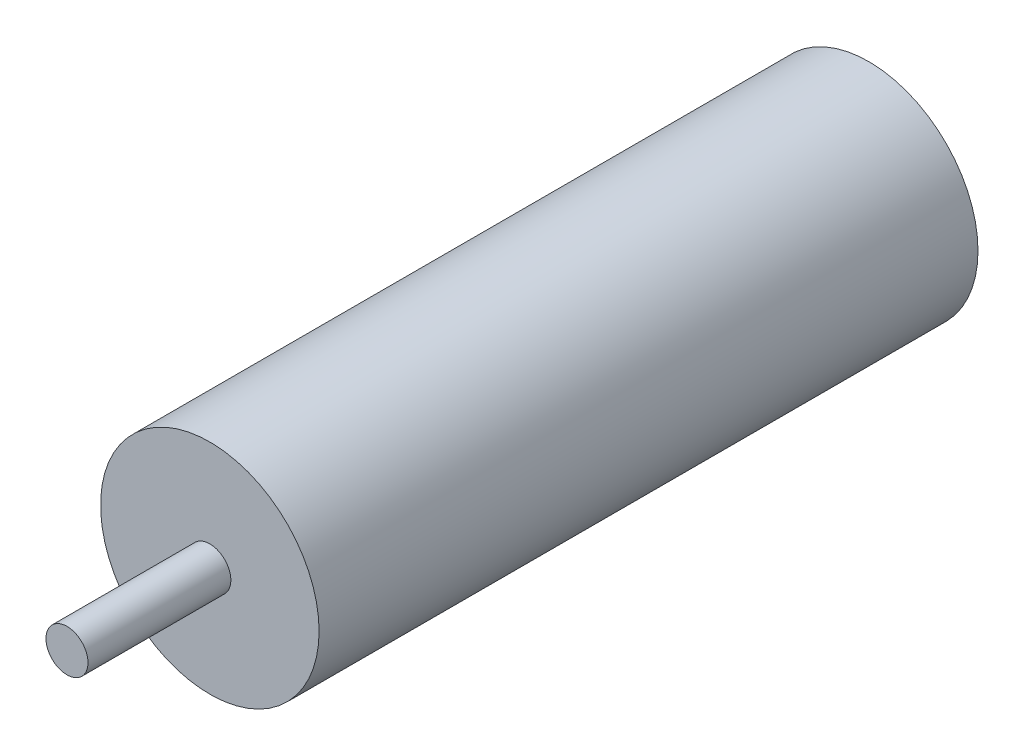
ISO-10303-21;
HEADER;
FILE_DESCRIPTION(('STEP AP214'),'2;1');
FILE_NAME('part.step','',(''),(''),'','','');
FILE_SCHEMA(('AUTOMOTIVE_DESIGN { 1 0 10303 214 1 1 1 1 }'));
ENDSEC;
DATA;
#1=APPLICATION_CONTEXT('core data for automotive mechanical design processes');
#2=APPLICATION_PROTOCOL_DEFINITION('international standard','automotive_design',2000,#1);
#3=PRODUCT_CONTEXT('',#1,'mechanical');
#4=PRODUCT('Part','Part','',(#3));
#5=PRODUCT_RELATED_PRODUCT_CATEGORY('part','',(#4));
#6=PRODUCT_DEFINITION_FORMATION('','',#4);
#7=PRODUCT_DEFINITION_CONTEXT('part definition',#1,'design');
#8=PRODUCT_DEFINITION('design','',#6,#7);
#9=PRODUCT_DEFINITION_SHAPE('','',#8);
#10=(LENGTH_UNIT() NAMED_UNIT(*) SI_UNIT(.MILLI.,.METRE.));
#11=(NAMED_UNIT(*) PLANE_ANGLE_UNIT() SI_UNIT($,.RADIAN.));
#12=(NAMED_UNIT(*) SI_UNIT($,.STERADIAN.) SOLID_ANGLE_UNIT());
#13=UNCERTAINTY_MEASURE_WITH_UNIT(LENGTH_MEASURE(1.E-05),#10,'distance_accuracy_value','');
#14=(GEOMETRIC_REPRESENTATION_CONTEXT(3) GLOBAL_UNCERTAINTY_ASSIGNED_CONTEXT((#13)) GLOBAL_UNIT_ASSIGNED_CONTEXT((#10,
#11,#12)) REPRESENTATION_CONTEXT('',''));
#15=CARTESIAN_POINT('',(0.,0.,0.));
#16=DIRECTION('',(0.,0.,1.));
#17=DIRECTION('',(1.,0.,0.));
#18=AXIS2_PLACEMENT_3D('',#15,#16,#17);
#19=CARTESIAN_POINT('',(0.,0.,78.4));
#20=DIRECTION('',(0.,0.,-1.));
#21=DIRECTION('',(-1.,0.,0.));
#22=AXIS2_PLACEMENT_3D('',#19,#20,#21);
#23=CYLINDRICAL_SURFACE('',#22,13.);
#24=CARTESIAN_POINT('',(0.,0.,78.4));
#25=DIRECTION('',(0.,0.,1.));
#26=DIRECTION('',(1.,0.,0.));
#27=AXIS2_PLACEMENT_3D('',#24,#25,#26);
#28=CIRCLE('',#27,13.);
#29=CARTESIAN_POINT('',(13.,0.,78.4));
#30=VERTEX_POINT('',#29);
#31=EDGE_CURVE('E37',#30,#30,#28,.T.);
#32=ORIENTED_EDGE('',*,*,#31,.F.);
#33=EDGE_LOOP('',(#32));
#34=FACE_BOUND('',#33,.T.);
#35=CARTESIAN_POINT('',(0.,0.,0.));
#36=DIRECTION('',(0.,0.,1.));
#37=DIRECTION('',(1.,0.,0.));
#38=AXIS2_PLACEMENT_3D('',#35,#36,#37);
#39=CIRCLE('',#38,13.);
#40=CARTESIAN_POINT('',(13.,0.,0.));
#41=VERTEX_POINT('',#40);
#42=EDGE_CURVE('E33',#41,#41,#39,.T.);
#43=ORIENTED_EDGE('',*,*,#42,.T.);
#44=EDGE_LOOP('',(#43));
#45=FACE_BOUND('',#44,.T.);
#46=ADVANCED_FACE('F30',(#34,#45),#23,.T.);
#47=CARTESIAN_POINT('',(0.,0.,78.4));
#48=DIRECTION('',(0.,0.,1.));
#49=DIRECTION('',(1.,0.,0.));
#50=AXIS2_PLACEMENT_3D('',#47,#48,#49);
#51=PLANE('',#50);
#52=CARTESIAN_POINT('',(0.,0.,78.4));
#53=DIRECTION('',(0.,0.,1.));
#54=DIRECTION('',(1.,0.,0.));
#55=AXIS2_PLACEMENT_3D('',#52,#53,#54);
#56=CIRCLE('',#55,2.5);
#57=CARTESIAN_POINT('',(2.5,0.,78.4));
#58=VERTEX_POINT('',#57);
#59=EDGE_CURVE('E10',#58,#58,#56,.T.);
#60=ORIENTED_EDGE('',*,*,#59,.F.);
#61=EDGE_LOOP('',(#60));
#62=FACE_BOUND('',#61,.T.);
#63=ORIENTED_EDGE('',*,*,#31,.T.);
#64=EDGE_LOOP('',(#63));
#65=FACE_BOUND('',#64,.T.);
#66=ADVANCED_FACE('F54',(#62,#65),#51,.T.);
#67=CARTESIAN_POINT('',(0.,0.,0.));
#68=DIRECTION('',(0.,0.,1.));
#69=DIRECTION('',(1.,0.,0.));
#70=AXIS2_PLACEMENT_3D('',#67,#68,#69);
#71=PLANE('',#70);
#72=ORIENTED_EDGE('',*,*,#42,.F.);
#73=EDGE_LOOP('',(#72));
#74=FACE_BOUND('',#73,.T.);
#75=ADVANCED_FACE('F51',(#74),#71,.F.);
#76=CARTESIAN_POINT('',(0.,0.,95.4));
#77=DIRECTION('',(0.,0.,-1.));
#78=DIRECTION('',(-1.,0.,0.));
#79=AXIS2_PLACEMENT_3D('',#76,#77,#78);
#80=CYLINDRICAL_SURFACE('',#79,2.5);
#81=CARTESIAN_POINT('',(0.,0.,95.4));
#82=DIRECTION('',(0.,0.,1.));
#83=DIRECTION('',(1.,0.,0.));
#84=AXIS2_PLACEMENT_3D('',#81,#82,#83);
#85=CIRCLE('',#84,2.5);
#86=CARTESIAN_POINT('',(2.5,0.,95.4));
#87=VERTEX_POINT('',#86);
#88=EDGE_CURVE('E43',#87,#87,#85,.T.);
#89=ORIENTED_EDGE('',*,*,#88,.F.);
#90=EDGE_LOOP('',(#89));
#91=FACE_BOUND('',#90,.T.);
#92=ORIENTED_EDGE('',*,*,#59,.T.);
#93=EDGE_LOOP('',(#92));
#94=FACE_BOUND('',#93,.T.);
#95=ADVANCED_FACE('F53',(#91,#94),#80,.T.);
#96=CARTESIAN_POINT('',(0.,0.,95.4));
#97=DIRECTION('',(0.,0.,1.));
#98=DIRECTION('',(1.,0.,0.));
#99=AXIS2_PLACEMENT_3D('',#96,#97,#98);
#100=PLANE('',#99);
#101=ORIENTED_EDGE('',*,*,#88,.T.);
#102=EDGE_LOOP('',(#101));
#103=FACE_BOUND('',#102,.T.);
#104=ADVANCED_FACE('F59',(#103),#100,.T.);
#105=CLOSED_SHELL('',(#46,#66,#75,#95,#104));
#106=MANIFOLD_SOLID_BREP('B2',#105);
#107=ADVANCED_BREP_SHAPE_REPRESENTATION('',(#18,#106),#14);
#108=SHAPE_DEFINITION_REPRESENTATION(#9,#107);
ENDSEC;
END-ISO-10303-21;
